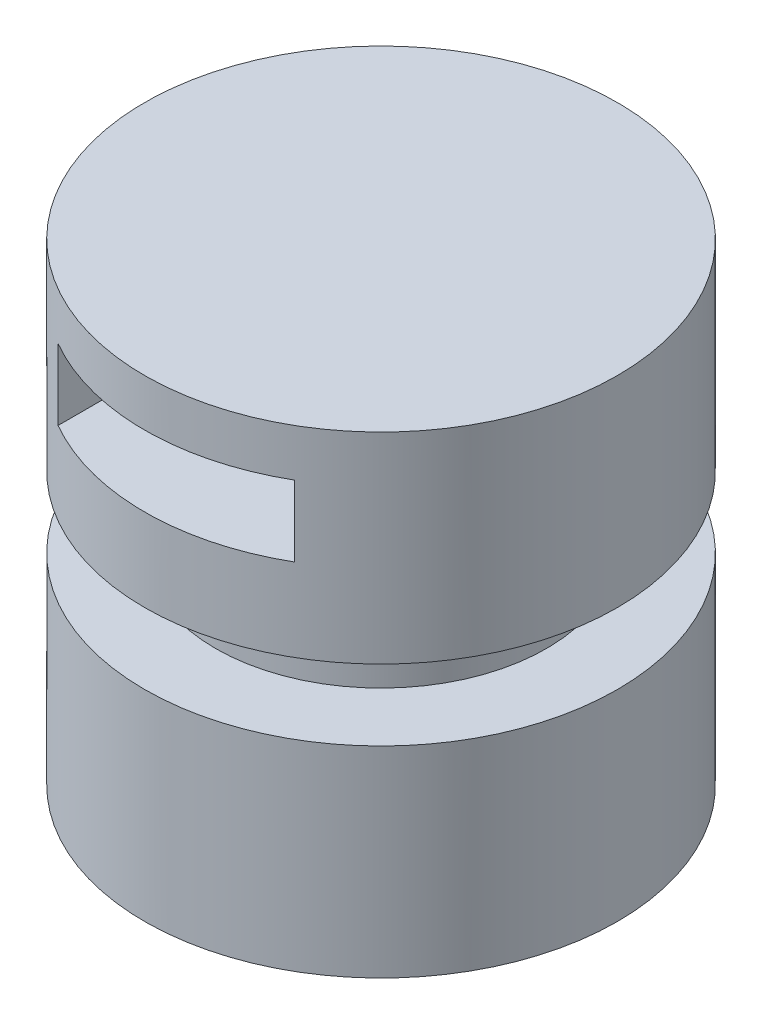
ISO-10303-21;
HEADER;
FILE_DESCRIPTION(('STEP AP214'),'2;1');
FILE_NAME('part.step','',(''),(''),'','','');
FILE_SCHEMA(('AUTOMOTIVE_DESIGN { 1 0 10303 214 1 1 1 1 }'));
ENDSEC;
DATA;
#1=APPLICATION_CONTEXT('core data for automotive mechanical design processes');
#2=APPLICATION_PROTOCOL_DEFINITION('international standard','automotive_design',2000,#1);
#3=PRODUCT_CONTEXT('',#1,'mechanical');
#4=PRODUCT('Part','Part','',(#3));
#5=PRODUCT_RELATED_PRODUCT_CATEGORY('part','',(#4));
#6=PRODUCT_DEFINITION_FORMATION('','',#4);
#7=PRODUCT_DEFINITION_CONTEXT('part definition',#1,'design');
#8=PRODUCT_DEFINITION('design','',#6,#7);
#9=PRODUCT_DEFINITION_SHAPE('','',#8);
#10=(LENGTH_UNIT() NAMED_UNIT(*) SI_UNIT(.MILLI.,.METRE.));
#11=(NAMED_UNIT(*) PLANE_ANGLE_UNIT() SI_UNIT($,.RADIAN.));
#12=(NAMED_UNIT(*) SI_UNIT($,.STERADIAN.) SOLID_ANGLE_UNIT());
#13=UNCERTAINTY_MEASURE_WITH_UNIT(LENGTH_MEASURE(1.E-05),#10,'distance_accuracy_value','');
#14=(GEOMETRIC_REPRESENTATION_CONTEXT(3) GLOBAL_UNCERTAINTY_ASSIGNED_CONTEXT((#13)) GLOBAL_UNIT_ASSIGNED_CONTEXT((#10,
#11,#12)) REPRESENTATION_CONTEXT('',''));
#15=CARTESIAN_POINT('',(0.,0.,0.));
#16=DIRECTION('',(0.,0.,1.));
#17=DIRECTION('',(1.,0.,0.));
#18=AXIS2_PLACEMENT_3D('',#15,#16,#17);
#19=CARTESIAN_POINT('',(0.,0.,0.));
#20=DIRECTION('',(0.,-1.,0.));
#21=DIRECTION('',(1.,0.,0.));
#22=AXIS2_PLACEMENT_3D('',#19,#20,#21);
#23=CYLINDRICAL_SURFACE('',#22,2540.);
#24=CARTESIAN_POINT('',(0.,-4.44089209850063E-13,0.));
#25=DIRECTION('',(0.,-1.,0.));
#26=DIRECTION('',(1.,0.,0.));
#27=AXIS2_PLACEMENT_3D('',#24,#25,#26);
#28=CIRCLE('',#27,2540.);
#29=CARTESIAN_POINT('',(2540.,0.,0.));
#30=VERTEX_POINT('',#29);
#31=EDGE_CURVE('E132',#30,#30,#28,.T.);
#32=ORIENTED_EDGE('',*,*,#31,.F.);
#33=EDGE_LOOP('',(#32));
#34=FACE_BOUND('',#33,.T.);
#35=CARTESIAN_POINT('',(0.,2159.,0.));
#36=DIRECTION('',(0.,1.,0.));
#37=DIRECTION('',(0.,0.,1.));
#38=AXIS2_PLACEMENT_3D('',#35,#36,#37);
#39=CIRCLE('',#38,2540.);
#40=CARTESIAN_POINT('',(0.,2159.,2540.));
#41=VERTEX_POINT('',#40);
#42=EDGE_CURVE('E124',#41,#41,#39,.T.);
#43=ORIENTED_EDGE('',*,*,#42,.F.);
#44=EDGE_LOOP('',(#43));
#45=FACE_BOUND('',#44,.T.);
#46=ADVANCED_FACE('F45',(#34,#45),#23,.T.);
#47=CARTESIAN_POINT('',(0.,-2.22044604925031E-13,0.));
#48=DIRECTION('',(0.,-1.,0.));
#49=DIRECTION('',(1.,0.,0.));
#50=AXIS2_PLACEMENT_3D('',#47,#48,#49);
#51=PLANE('',#50);
#52=ORIENTED_EDGE('',*,*,#31,.T.);
#53=EDGE_LOOP('',(#52));
#54=FACE_BOUND('',#53,.T.);
#55=ADVANCED_FACE('F176',(#54),#51,.T.);
#56=CARTESIAN_POINT('',(0.,5080.,0.));
#57=DIRECTION('',(0.,1.,0.));
#58=DIRECTION('',(0.,0.,1.));
#59=AXIS2_PLACEMENT_3D('',#56,#57,#58);
#60=CYLINDRICAL_SURFACE('',#59,1778.);
#61=CARTESIAN_POINT('',(0.,2159.,0.));
#62=DIRECTION('',(0.,1.,0.));
#63=DIRECTION('',(0.,0.,1.));
#64=AXIS2_PLACEMENT_3D('',#61,#62,#63);
#65=CIRCLE('',#64,1778.);
#66=CARTESIAN_POINT('',(0.,2159.,1778.));
#67=VERTEX_POINT('',#66);
#68=EDGE_CURVE('E128',#67,#67,#65,.T.);
#69=ORIENTED_EDGE('',*,*,#68,.T.);
#70=EDGE_LOOP('',(#69));
#71=FACE_BOUND('',#70,.T.);
#72=CARTESIAN_POINT('',(0.,2921.,0.));
#73=DIRECTION('',(0.,1.,0.));
#74=DIRECTION('',(0.,0.,1.));
#75=AXIS2_PLACEMENT_3D('',#72,#73,#74);
#76=CIRCLE('',#75,1778.);
#77=CARTESIAN_POINT('',(0.,2921.,1778.));
#78=VERTEX_POINT('',#77);
#79=EDGE_CURVE('E116',#78,#78,#76,.T.);
#80=ORIENTED_EDGE('',*,*,#79,.F.);
#81=EDGE_LOOP('',(#80));
#82=FACE_BOUND('',#81,.T.);
#83=ADVANCED_FACE('F171',(#71,#82),#60,.T.);
#84=CARTESIAN_POINT('',(1778.,2159.,0.));
#85=DIRECTION('',(0.,1.,0.));
#86=DIRECTION('',(0.,0.,1.));
#87=AXIS2_PLACEMENT_3D('',#84,#85,#86);
#88=PLANE('',#87);
#89=ORIENTED_EDGE('',*,*,#42,.T.);
#90=EDGE_LOOP('',(#89));
#91=FACE_BOUND('',#90,.T.);
#92=ORIENTED_EDGE('',*,*,#68,.F.);
#93=EDGE_LOOP('',(#92));
#94=FACE_BOUND('',#93,.T.);
#95=ADVANCED_FACE('F163',(#91,#94),#88,.T.);
#96=CARTESIAN_POINT('',(1778.,2921.,0.));
#97=DIRECTION('',(0.,-1.,0.));
#98=DIRECTION('',(0.,0.,-1.));
#99=AXIS2_PLACEMENT_3D('',#96,#97,#98);
#100=PLANE('',#99);
#101=ORIENTED_EDGE('',*,*,#79,.T.);
#102=EDGE_LOOP('',(#101));
#103=FACE_BOUND('',#102,.T.);
#104=CARTESIAN_POINT('',(0.,2921.,0.));
#105=DIRECTION('',(0.,1.,0.));
#106=DIRECTION('',(0.,0.,1.));
#107=AXIS2_PLACEMENT_3D('',#104,#105,#106);
#108=CIRCLE('',#107,2540.);
#109=CARTESIAN_POINT('',(0.,2921.,2540.));
#110=VERTEX_POINT('',#109);
#111=EDGE_CURVE('E120',#110,#110,#108,.T.);
#112=ORIENTED_EDGE('',*,*,#111,.F.);
#113=EDGE_LOOP('',(#112));
#114=FACE_BOUND('',#113,.T.);
#115=ADVANCED_FACE('F161',(#103,#114),#100,.T.);
#116=CARTESIAN_POINT('',(-8.88178419700125E-13,5080.,0.));
#117=DIRECTION('',(0.,1.,0.));
#118=DIRECTION('',(-1.,0.,0.));
#119=AXIS2_PLACEMENT_3D('',#116,#117,#118);
#120=PLANE('',#119);
#121=CARTESIAN_POINT('',(-8.88178419700125E-13,5080.,0.));
#122=DIRECTION('',(0.,-1.,0.));
#123=DIRECTION('',(1.,0.,0.));
#124=AXIS2_PLACEMENT_3D('',#121,#122,#123);
#125=CIRCLE('',#124,2540.);
#126=CARTESIAN_POINT('',(2540.,5080.,0.));
#127=VERTEX_POINT('',#126);
#128=EDGE_CURVE('E136',#127,#127,#125,.T.);
#129=ORIENTED_EDGE('',*,*,#128,.F.);
#130=EDGE_LOOP('',(#129));
#131=FACE_BOUND('',#130,.T.);
#132=ADVANCED_FACE('F47',(#131),#120,.T.);
#133=CARTESIAN_POINT('',(-6.66133814775094E-13,3810.,0.));
#134=DIRECTION('',(0.,-1.,0.));
#135=DIRECTION('',(1.,0.,0.));
#136=AXIS2_PLACEMENT_3D('',#133,#134,#135);
#137=CIRCLE('',#136,2540.);
#138=CARTESIAN_POINT('',(1270.,3810.,-2199.70452561247));
#139=VERTEX_POINT('',#138);
#140=CARTESIAN_POINT('',(-1270.,3810.,-2199.70452561247));
#141=VERTEX_POINT('',#140);
#142=EDGE_CURVE('E86',#139,#141,#137,.F.);
#143=ORIENTED_EDGE('',*,*,#142,.F.);
#144=DIRECTION('',(0.,-1.,0.));
#145=VECTOR('',#144,1.);
#146=CARTESIAN_POINT('',(1269.99999999999,-2.59052039079202E-12,-2199.70452561248));
#147=LINE('',#146,#145);
#148=CARTESIAN_POINT('',(1270.,4572.,-2199.70452561248));
#149=VERTEX_POINT('',#148);
#150=EDGE_CURVE('E11',#149,#139,#147,.T.);
#151=ORIENTED_EDGE('',*,*,#150,.F.);
#152=CARTESIAN_POINT('',(-7.99360577730113E-13,4572.,0.));
#153=DIRECTION('',(0.,1.,0.));
#154=DIRECTION('',(-1.,0.,0.));
#155=AXIS2_PLACEMENT_3D('',#152,#153,#154);
#156=CIRCLE('',#155,2540.);
#157=CARTESIAN_POINT('',(-1270.,4572.,-2199.70452561247));
#158=VERTEX_POINT('',#157);
#159=EDGE_CURVE('E69',#158,#149,#156,.F.);
#160=ORIENTED_EDGE('',*,*,#159,.F.);
#161=DIRECTION('',(0.,-1.,0.));
#162=VECTOR('',#161,1.);
#163=CARTESIAN_POINT('',(-1269.99999999999,-2.59052039079202E-12,-2199.70452561248));
#164=LINE('',#163,#162);
#165=EDGE_CURVE('E54',#141,#158,#164,.F.);
#166=ORIENTED_EDGE('',*,*,#165,.F.);
#167=EDGE_LOOP('',(#143,#151,#160,#166));
#168=FACE_BOUND('',#167,.T.);
#169=CARTESIAN_POINT('',(-1270.,3810.,2199.70452561247));
#170=VERTEX_POINT('',#169);
#171=CARTESIAN_POINT('',(1270.,3810.,2199.70452561247));
#172=VERTEX_POINT('',#171);
#173=EDGE_CURVE('E96',#170,#172,#137,.F.);
#174=ORIENTED_EDGE('',*,*,#173,.F.);
#175=DIRECTION('',(0.,-1.,0.));
#176=VECTOR('',#175,1.);
#177=CARTESIAN_POINT('',(-1269.99999999999,-2.59052039079202E-12,2199.70452561248));
#178=LINE('',#177,#176);
#179=CARTESIAN_POINT('',(-1270.,4572.,2199.70452561247));
#180=VERTEX_POINT('',#179);
#181=EDGE_CURVE('E94',#180,#170,#178,.T.);
#182=ORIENTED_EDGE('',*,*,#181,.F.);
#183=CARTESIAN_POINT('',(1270.,4572.,2199.70452561248));
#184=VERTEX_POINT('',#183);
#185=EDGE_CURVE('E61',#184,#180,#156,.F.);
#186=ORIENTED_EDGE('',*,*,#185,.F.);
#187=DIRECTION('',(0.,-1.,0.));
#188=VECTOR('',#187,1.);
#189=CARTESIAN_POINT('',(1269.99999999999,-2.59052039079202E-12,2199.70452561248));
#190=LINE('',#189,#188);
#191=EDGE_CURVE('E141',#172,#184,#190,.F.);
#192=ORIENTED_EDGE('',*,*,#191,.F.);
#193=EDGE_LOOP('',(#174,#182,#186,#192));
#194=FACE_BOUND('',#193,.T.);
#195=ORIENTED_EDGE('',*,*,#128,.T.);
#196=EDGE_LOOP('',(#195));
#197=FACE_BOUND('',#196,.T.);
#198=ORIENTED_EDGE('',*,*,#111,.T.);
#199=EDGE_LOOP('',(#198));
#200=FACE_BOUND('',#199,.T.);
#201=ADVANCED_FACE('F87',(#168,#194,#197,#200),#23,.T.);
#202=CARTESIAN_POINT('',(-1270.,4572.,-2540.));
#203=DIRECTION('',(-1.,0.,0.));
#204=DIRECTION('',(0.,-1.,0.));
#205=AXIS2_PLACEMENT_3D('',#202,#203,#204);
#206=PLANE('',#205);
#207=ORIENTED_EDGE('',*,*,#165,.T.);
#208=DIRECTION('',(0.,0.,1.));
#209=VECTOR('',#208,1.);
#210=CARTESIAN_POINT('',(-1270.,4572.,-2540.));
#211=LINE('',#210,#209);
#212=EDGE_CURVE('E111',#158,#180,#211,.T.);
#213=ORIENTED_EDGE('',*,*,#212,.T.);
#214=ORIENTED_EDGE('',*,*,#181,.T.);
#215=DIRECTION('',(0.,0.,1.));
#216=VECTOR('',#215,1.);
#217=CARTESIAN_POINT('',(-1270.,3810.,-2540.));
#218=LINE('',#217,#216);
#219=EDGE_CURVE('E107',#141,#170,#218,.T.);
#220=ORIENTED_EDGE('',*,*,#219,.F.);
#221=EDGE_LOOP('',(#207,#213,#214,#220));
#222=FACE_BOUND('',#221,.T.);
#223=ADVANCED_FACE('F154',(#222),#206,.F.);
#224=CARTESIAN_POINT('',(-1270.,4572.,-2540.));
#225=DIRECTION('',(0.,1.,0.));
#226=DIRECTION('',(-1.,0.,0.));
#227=AXIS2_PLACEMENT_3D('',#224,#225,#226);
#228=PLANE('',#227);
#229=ORIENTED_EDGE('',*,*,#212,.F.);
#230=ORIENTED_EDGE('',*,*,#159,.T.);
#231=DIRECTION('',(0.,0.,1.));
#232=VECTOR('',#231,1.);
#233=CARTESIAN_POINT('',(1270.,4572.,-2540.));
#234=LINE('',#233,#232);
#235=EDGE_CURVE('E104',#149,#184,#234,.T.);
#236=ORIENTED_EDGE('',*,*,#235,.T.);
#237=ORIENTED_EDGE('',*,*,#185,.T.);
#238=EDGE_LOOP('',(#229,#230,#236,#237));
#239=FACE_BOUND('',#238,.T.);
#240=ADVANCED_FACE('F151',(#239),#228,.F.);
#241=CARTESIAN_POINT('',(1270.,4572.,-2540.));
#242=DIRECTION('',(1.,0.,0.));
#243=DIRECTION('',(0.,1.,0.));
#244=AXIS2_PLACEMENT_3D('',#241,#242,#243);
#245=PLANE('',#244);
#246=ORIENTED_EDGE('',*,*,#191,.T.);
#247=ORIENTED_EDGE('',*,*,#235,.F.);
#248=ORIENTED_EDGE('',*,*,#150,.T.);
#249=DIRECTION('',(0.,0.,1.));
#250=VECTOR('',#249,1.);
#251=CARTESIAN_POINT('',(1270.,3810.,-2540.));
#252=LINE('',#251,#250);
#253=EDGE_CURVE('E102',#139,#172,#252,.T.);
#254=ORIENTED_EDGE('',*,*,#253,.T.);
#255=EDGE_LOOP('',(#246,#247,#248,#254));
#256=FACE_BOUND('',#255,.T.);
#257=ADVANCED_FACE('F101',(#256),#245,.F.);
#258=CARTESIAN_POINT('',(-1270.,3810.,-2540.));
#259=DIRECTION('',(0.,-1.,0.));
#260=DIRECTION('',(1.,0.,0.));
#261=AXIS2_PLACEMENT_3D('',#258,#259,#260);
#262=PLANE('',#261);
#263=ORIENTED_EDGE('',*,*,#253,.F.);
#264=ORIENTED_EDGE('',*,*,#142,.T.);
#265=ORIENTED_EDGE('',*,*,#219,.T.);
#266=ORIENTED_EDGE('',*,*,#173,.T.);
#267=EDGE_LOOP('',(#263,#264,#265,#266));
#268=FACE_BOUND('',#267,.T.);
#269=ADVANCED_FACE('F105',(#268),#262,.F.);
#270=CLOSED_SHELL('',(#46,#55,#83,#95,#115,#132,#201,#223,#240,#257,#269));
#271=MANIFOLD_SOLID_BREP('B2',#270);
#272=ADVANCED_BREP_SHAPE_REPRESENTATION('',(#18,#271),#14);
#273=SHAPE_DEFINITION_REPRESENTATION(#9,#272);
ENDSEC;
END-ISO-10303-21;
